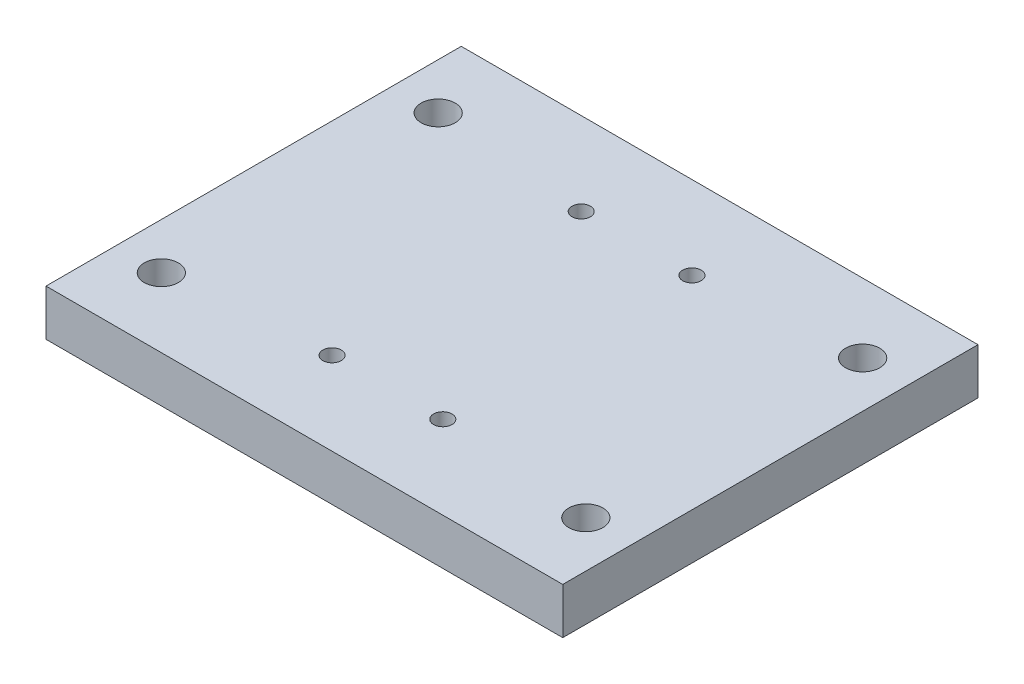
ISO-10303-21;
HEADER;
FILE_DESCRIPTION(('STEP AP214'),'2;1');
FILE_NAME('part.step','',(''),(''),'','','');
FILE_SCHEMA(('AUTOMOTIVE_DESIGN { 1 0 10303 214 1 1 1 1 }'));
ENDSEC;
DATA;
#1=APPLICATION_CONTEXT('core data for automotive mechanical design processes');
#2=APPLICATION_PROTOCOL_DEFINITION('international standard','automotive_design',2000,#1);
#3=PRODUCT_CONTEXT('',#1,'mechanical');
#4=PRODUCT('Part','Part','',(#3));
#5=PRODUCT_RELATED_PRODUCT_CATEGORY('part','',(#4));
#6=PRODUCT_DEFINITION_FORMATION('','',#4);
#7=PRODUCT_DEFINITION_CONTEXT('part definition',#1,'design');
#8=PRODUCT_DEFINITION('design','',#6,#7);
#9=PRODUCT_DEFINITION_SHAPE('','',#8);
#10=(LENGTH_UNIT() NAMED_UNIT(*) SI_UNIT(.MILLI.,.METRE.));
#11=(NAMED_UNIT(*) PLANE_ANGLE_UNIT() SI_UNIT($,.RADIAN.));
#12=(NAMED_UNIT(*) SI_UNIT($,.STERADIAN.) SOLID_ANGLE_UNIT());
#13=UNCERTAINTY_MEASURE_WITH_UNIT(LENGTH_MEASURE(1.E-05),#10,'distance_accuracy_value','');
#14=(GEOMETRIC_REPRESENTATION_CONTEXT(3) GLOBAL_UNCERTAINTY_ASSIGNED_CONTEXT((#13)) GLOBAL_UNIT_ASSIGNED_CONTEXT((#10,
#11,#12)) REPRESENTATION_CONTEXT('',''));
#15=CARTESIAN_POINT('',(0.,0.,0.));
#16=DIRECTION('',(0.,0.,1.));
#17=DIRECTION('',(1.,0.,0.));
#18=AXIS2_PLACEMENT_3D('',#15,#16,#17);
#19=CARTESIAN_POINT('',(0.,5.,0.));
#20=DIRECTION('',(1.,0.,0.));
#21=DIRECTION('',(0.,0.,-1.));
#22=AXIS2_PLACEMENT_3D('',#19,#20,#21);
#23=PLANE('',#22);
#24=DIRECTION('',(0.,0.,1.));
#25=VECTOR('',#24,1.);
#26=CARTESIAN_POINT('',(0.,0.,0.));
#27=LINE('',#26,#25);
#28=CARTESIAN_POINT('',(0.,0.,-45.));
#29=VERTEX_POINT('',#28);
#30=CARTESIAN_POINT('',(0.,0.,0.));
#31=VERTEX_POINT('',#30);
#32=EDGE_CURVE('E99',#29,#31,#27,.T.);
#33=ORIENTED_EDGE('',*,*,#32,.T.);
#34=DIRECTION('',(0.,-1.,0.));
#35=VECTOR('',#34,1.);
#36=CARTESIAN_POINT('',(0.,5.,0.));
#37=LINE('',#36,#35);
#38=CARTESIAN_POINT('',(0.,5.,0.));
#39=VERTEX_POINT('',#38);
#40=EDGE_CURVE('E11',#39,#31,#37,.T.);
#41=ORIENTED_EDGE('',*,*,#40,.F.);
#42=DIRECTION('',(0.,0.,1.));
#43=VECTOR('',#42,1.);
#44=CARTESIAN_POINT('',(0.,5.,0.));
#45=LINE('',#44,#43);
#46=CARTESIAN_POINT('',(0.,5.,-45.));
#47=VERTEX_POINT('',#46);
#48=EDGE_CURVE('E87',#47,#39,#45,.T.);
#49=ORIENTED_EDGE('',*,*,#48,.F.);
#50=DIRECTION('',(0.,-1.,0.));
#51=VECTOR('',#50,1.);
#52=CARTESIAN_POINT('',(0.,5.,-45.));
#53=LINE('',#52,#51);
#54=EDGE_CURVE('E95',#47,#29,#53,.T.);
#55=ORIENTED_EDGE('',*,*,#54,.T.);
#56=EDGE_LOOP('',(#33,#41,#49,#55));
#57=FACE_BOUND('',#56,.T.);
#58=ADVANCED_FACE('F36',(#57),#23,.F.);
#59=CARTESIAN_POINT('',(0.,5.,0.));
#60=DIRECTION('',(0.,0.,-1.));
#61=DIRECTION('',(-1.,0.,0.));
#62=AXIS2_PLACEMENT_3D('',#59,#60,#61);
#63=PLANE('',#62);
#64=DIRECTION('',(1.,0.,0.));
#65=VECTOR('',#64,1.);
#66=CARTESIAN_POINT('',(0.,0.,0.));
#67=LINE('',#66,#65);
#68=CARTESIAN_POINT('',(56.,0.,0.));
#69=VERTEX_POINT('',#68);
#70=EDGE_CURVE('E91',#31,#69,#67,.T.);
#71=ORIENTED_EDGE('',*,*,#70,.T.);
#72=DIRECTION('',(0.,-1.,0.));
#73=VECTOR('',#72,1.);
#74=CARTESIAN_POINT('',(56.,5.,0.));
#75=LINE('',#74,#73);
#76=CARTESIAN_POINT('',(56.,5.,0.));
#77=VERTEX_POINT('',#76);
#78=EDGE_CURVE('E44',#77,#69,#75,.T.);
#79=ORIENTED_EDGE('',*,*,#78,.F.);
#80=DIRECTION('',(1.,0.,0.));
#81=VECTOR('',#80,1.);
#82=CARTESIAN_POINT('',(0.,5.,0.));
#83=LINE('',#82,#81);
#84=EDGE_CURVE('E82',#39,#77,#83,.T.);
#85=ORIENTED_EDGE('',*,*,#84,.F.);
#86=ORIENTED_EDGE('',*,*,#40,.T.);
#87=EDGE_LOOP('',(#71,#79,#85,#86));
#88=FACE_BOUND('',#87,.T.);
#89=ADVANCED_FACE('F90',(#88),#63,.F.);
#90=CARTESIAN_POINT('',(56.,5.,0.));
#91=DIRECTION('',(-1.,0.,0.));
#92=DIRECTION('',(0.,0.,1.));
#93=AXIS2_PLACEMENT_3D('',#90,#91,#92);
#94=PLANE('',#93);
#95=DIRECTION('',(0.,0.,-1.));
#96=VECTOR('',#95,1.);
#97=CARTESIAN_POINT('',(56.,0.,0.));
#98=LINE('',#97,#96);
#99=CARTESIAN_POINT('',(56.,0.,-45.));
#100=VERTEX_POINT('',#99);
#101=EDGE_CURVE('E69',#69,#100,#98,.T.);
#102=ORIENTED_EDGE('',*,*,#101,.T.);
#103=DIRECTION('',(0.,-1.,0.));
#104=VECTOR('',#103,1.);
#105=CARTESIAN_POINT('',(56.,5.,-45.));
#106=LINE('',#105,#104);
#107=CARTESIAN_POINT('',(56.,5.,-45.));
#108=VERTEX_POINT('',#107);
#109=EDGE_CURVE('E92',#108,#100,#106,.T.);
#110=ORIENTED_EDGE('',*,*,#109,.F.);
#111=DIRECTION('',(0.,0.,-1.));
#112=VECTOR('',#111,1.);
#113=CARTESIAN_POINT('',(56.,5.,0.));
#114=LINE('',#113,#112);
#115=EDGE_CURVE('E85',#77,#108,#114,.T.);
#116=ORIENTED_EDGE('',*,*,#115,.F.);
#117=ORIENTED_EDGE('',*,*,#78,.T.);
#118=EDGE_LOOP('',(#102,#110,#116,#117));
#119=FACE_BOUND('',#118,.T.);
#120=ADVANCED_FACE('F93',(#119),#94,.F.);
#121=CARTESIAN_POINT('',(0.,5.,-45.));
#122=DIRECTION('',(0.,0.,1.));
#123=DIRECTION('',(1.,0.,0.));
#124=AXIS2_PLACEMENT_3D('',#121,#122,#123);
#125=PLANE('',#124);
#126=DIRECTION('',(-1.,0.,0.));
#127=VECTOR('',#126,1.);
#128=CARTESIAN_POINT('',(0.,0.,-45.));
#129=LINE('',#128,#127);
#130=EDGE_CURVE('E75',#100,#29,#129,.T.);
#131=ORIENTED_EDGE('',*,*,#130,.T.);
#132=ORIENTED_EDGE('',*,*,#54,.F.);
#133=DIRECTION('',(-1.,0.,0.));
#134=VECTOR('',#133,1.);
#135=CARTESIAN_POINT('',(0.,5.,-45.));
#136=LINE('',#135,#134);
#137=EDGE_CURVE('E52',#108,#47,#136,.T.);
#138=ORIENTED_EDGE('',*,*,#137,.F.);
#139=ORIENTED_EDGE('',*,*,#109,.T.);
#140=EDGE_LOOP('',(#131,#132,#138,#139));
#141=FACE_BOUND('',#140,.T.);
#142=ADVANCED_FACE('F107',(#141),#125,.F.);
#143=CARTESIAN_POINT('',(0.,5.,0.));
#144=DIRECTION('',(0.,-1.,0.));
#145=DIRECTION('',(0.,0.,-1.));
#146=AXIS2_PLACEMENT_3D('',#143,#144,#145);
#147=PLANE('',#146);
#148=CARTESIAN_POINT('',(34.,5.,-36.));
#149=DIRECTION('',(0.,1.,0.));
#150=DIRECTION('',(0.,0.,1.));
#151=AXIS2_PLACEMENT_3D('',#148,#149,#150);
#152=CIRCLE('',#151,0.999999999999998);
#153=CARTESIAN_POINT('',(34.,5.,-35.));
#154=VERTEX_POINT('',#153);
#155=EDGE_CURVE('E146',#154,#154,#152,.T.);
#156=ORIENTED_EDGE('',*,*,#155,.F.);
#157=EDGE_LOOP('',(#156));
#158=FACE_BOUND('',#157,.T.);
#159=CARTESIAN_POINT('',(34.,5.,-9.));
#160=DIRECTION('',(0.,1.,0.));
#161=DIRECTION('',(0.,0.,1.));
#162=AXIS2_PLACEMENT_3D('',#159,#160,#161);
#163=CIRCLE('',#162,0.999999999999998);
#164=CARTESIAN_POINT('',(34.,5.,-8.));
#165=VERTEX_POINT('',#164);
#166=EDGE_CURVE('E152',#165,#165,#163,.T.);
#167=ORIENTED_EDGE('',*,*,#166,.F.);
#168=EDGE_LOOP('',(#167));
#169=FACE_BOUND('',#168,.T.);
#170=CARTESIAN_POINT('',(22.,5.,-9.));
#171=DIRECTION('',(0.,1.,0.));
#172=DIRECTION('',(0.,0.,1.));
#173=AXIS2_PLACEMENT_3D('',#170,#171,#172);
#174=CIRCLE('',#173,1.);
#175=CARTESIAN_POINT('',(22.,5.,-8.));
#176=VERTEX_POINT('',#175);
#177=EDGE_CURVE('E140',#176,#176,#174,.T.);
#178=ORIENTED_EDGE('',*,*,#177,.F.);
#179=EDGE_LOOP('',(#178));
#180=FACE_BOUND('',#179,.T.);
#181=CARTESIAN_POINT('',(22.,5.,-36.));
#182=DIRECTION('',(0.,1.,0.));
#183=DIRECTION('',(0.,0.,1.));
#184=AXIS2_PLACEMENT_3D('',#181,#182,#183);
#185=CIRCLE('',#184,1.);
#186=CARTESIAN_POINT('',(22.,5.,-35.));
#187=VERTEX_POINT('',#186);
#188=EDGE_CURVE('E137',#187,#187,#185,.T.);
#189=ORIENTED_EDGE('',*,*,#188,.F.);
#190=EDGE_LOOP('',(#189));
#191=FACE_BOUND('',#190,.T.);
#192=CARTESIAN_POINT('',(5.,5.,-7.5));
#193=DIRECTION('',(0.,1.,0.));
#194=DIRECTION('',(0.,0.,1.));
#195=AXIS2_PLACEMENT_3D('',#192,#193,#194);
#196=CIRCLE('',#195,1.85);
#197=CARTESIAN_POINT('',(5.,5.,-5.65));
#198=VERTEX_POINT('',#197);
#199=EDGE_CURVE('E119',#198,#198,#196,.T.);
#200=ORIENTED_EDGE('',*,*,#199,.F.);
#201=EDGE_LOOP('',(#200));
#202=FACE_BOUND('',#201,.T.);
#203=CARTESIAN_POINT('',(51.,5.,-7.5));
#204=DIRECTION('',(0.,1.,0.));
#205=DIRECTION('',(0.,0.,1.));
#206=AXIS2_PLACEMENT_3D('',#203,#204,#205);
#207=CIRCLE('',#206,1.85);
#208=CARTESIAN_POINT('',(51.,5.,-5.65));
#209=VERTEX_POINT('',#208);
#210=EDGE_CURVE('E126',#209,#209,#207,.T.);
#211=ORIENTED_EDGE('',*,*,#210,.F.);
#212=EDGE_LOOP('',(#211));
#213=FACE_BOUND('',#212,.T.);
#214=CARTESIAN_POINT('',(51.,5.,-37.5));
#215=DIRECTION('',(0.,1.,0.));
#216=DIRECTION('',(0.,0.,1.));
#217=AXIS2_PLACEMENT_3D('',#214,#215,#216);
#218=CIRCLE('',#217,1.85);
#219=CARTESIAN_POINT('',(51.,5.,-35.65));
#220=VERTEX_POINT('',#219);
#221=EDGE_CURVE('E132',#220,#220,#218,.T.);
#222=ORIENTED_EDGE('',*,*,#221,.F.);
#223=EDGE_LOOP('',(#222));
#224=FACE_BOUND('',#223,.T.);
#225=CARTESIAN_POINT('',(5.,5.,-37.5));
#226=DIRECTION('',(0.,1.,0.));
#227=DIRECTION('',(0.,0.,1.));
#228=AXIS2_PLACEMENT_3D('',#225,#226,#227);
#229=CIRCLE('',#228,1.85);
#230=CARTESIAN_POINT('',(5.,5.,-35.65));
#231=VERTEX_POINT('',#230);
#232=EDGE_CURVE('E113',#231,#231,#229,.T.);
#233=ORIENTED_EDGE('',*,*,#232,.F.);
#234=EDGE_LOOP('',(#233));
#235=FACE_BOUND('',#234,.T.);
#236=ORIENTED_EDGE('',*,*,#48,.T.);
#237=ORIENTED_EDGE('',*,*,#84,.T.);
#238=ORIENTED_EDGE('',*,*,#115,.T.);
#239=ORIENTED_EDGE('',*,*,#137,.T.);
#240=EDGE_LOOP('',(#236,#237,#238,#239));
#241=FACE_BOUND('',#240,.T.);
#242=ADVANCED_FACE('F83',(#158,#169,#180,#191,#202,#213,#224,#235,#241),#147,.F.);
#243=CARTESIAN_POINT('',(0.,0.,0.));
#244=DIRECTION('',(0.,-1.,0.));
#245=DIRECTION('',(0.,0.,-1.));
#246=AXIS2_PLACEMENT_3D('',#243,#244,#245);
#247=PLANE('',#246);
#248=CARTESIAN_POINT('',(34.,0.,-36.));
#249=DIRECTION('',(0.,1.,0.));
#250=DIRECTION('',(0.,0.,1.));
#251=AXIS2_PLACEMENT_3D('',#248,#249,#250);
#252=CIRCLE('',#251,0.999999999999998);
#253=CARTESIAN_POINT('',(34.,0.,-35.));
#254=VERTEX_POINT('',#253);
#255=EDGE_CURVE('E143',#254,#254,#252,.T.);
#256=ORIENTED_EDGE('',*,*,#255,.T.);
#257=EDGE_LOOP('',(#256));
#258=FACE_BOUND('',#257,.T.);
#259=CARTESIAN_POINT('',(34.,0.,-9.));
#260=DIRECTION('',(0.,1.,0.));
#261=DIRECTION('',(0.,0.,1.));
#262=AXIS2_PLACEMENT_3D('',#259,#260,#261);
#263=CIRCLE('',#262,0.999999999999998);
#264=CARTESIAN_POINT('',(34.,0.,-8.));
#265=VERTEX_POINT('',#264);
#266=EDGE_CURVE('E149',#265,#265,#263,.T.);
#267=ORIENTED_EDGE('',*,*,#266,.T.);
#268=EDGE_LOOP('',(#267));
#269=FACE_BOUND('',#268,.T.);
#270=CARTESIAN_POINT('',(22.,0.,-9.));
#271=DIRECTION('',(0.,1.,0.));
#272=DIRECTION('',(0.,0.,1.));
#273=AXIS2_PLACEMENT_3D('',#270,#271,#272);
#274=CIRCLE('',#273,1.);
#275=CARTESIAN_POINT('',(22.,0.,-8.));
#276=VERTEX_POINT('',#275);
#277=EDGE_CURVE('E155',#276,#276,#274,.T.);
#278=ORIENTED_EDGE('',*,*,#277,.T.);
#279=EDGE_LOOP('',(#278));
#280=FACE_BOUND('',#279,.T.);
#281=CARTESIAN_POINT('',(22.,0.,-36.));
#282=DIRECTION('',(0.,1.,0.));
#283=DIRECTION('',(0.,0.,1.));
#284=AXIS2_PLACEMENT_3D('',#281,#282,#283);
#285=CIRCLE('',#284,1.);
#286=CARTESIAN_POINT('',(22.,0.,-35.));
#287=VERTEX_POINT('',#286);
#288=EDGE_CURVE('E123',#287,#287,#285,.T.);
#289=ORIENTED_EDGE('',*,*,#288,.T.);
#290=EDGE_LOOP('',(#289));
#291=FACE_BOUND('',#290,.T.);
#292=ORIENTED_EDGE('',*,*,#32,.F.);
#293=ORIENTED_EDGE('',*,*,#130,.F.);
#294=ORIENTED_EDGE('',*,*,#101,.F.);
#295=ORIENTED_EDGE('',*,*,#70,.F.);
#296=EDGE_LOOP('',(#292,#293,#294,#295));
#297=FACE_BOUND('',#296,.T.);
#298=ADVANCED_FACE('F110',(#258,#269,#280,#291,#297),#247,.T.);
#299=CARTESIAN_POINT('',(5.,2.,-37.5));
#300=DIRECTION('',(0.,1.,0.));
#301=DIRECTION('',(0.,0.,1.));
#302=AXIS2_PLACEMENT_3D('',#299,#300,#301);
#303=CYLINDRICAL_SURFACE('',#302,1.85);
#304=CARTESIAN_POINT('',(5.,2.,-37.5));
#305=DIRECTION('',(0.,1.,0.));
#306=DIRECTION('',(0.,0.,1.));
#307=AXIS2_PLACEMENT_3D('',#304,#305,#306);
#308=CIRCLE('',#307,1.85);
#309=CARTESIAN_POINT('',(5.,2.,-35.65));
#310=VERTEX_POINT('',#309);
#311=EDGE_CURVE('E102',#310,#310,#308,.T.);
#312=ORIENTED_EDGE('',*,*,#311,.F.);
#313=EDGE_LOOP('',(#312));
#314=FACE_BOUND('',#313,.T.);
#315=ORIENTED_EDGE('',*,*,#232,.T.);
#316=EDGE_LOOP('',(#315));
#317=FACE_BOUND('',#316,.T.);
#318=ADVANCED_FACE('F177',(#314,#317),#303,.F.);
#319=CARTESIAN_POINT('',(0.,2.,0.));
#320=DIRECTION('',(0.,1.,0.));
#321=DIRECTION('',(0.,0.,1.));
#322=AXIS2_PLACEMENT_3D('',#319,#320,#321);
#323=PLANE('',#322);
#324=ORIENTED_EDGE('',*,*,#311,.T.);
#325=EDGE_LOOP('',(#324));
#326=FACE_BOUND('',#325,.T.);
#327=ADVANCED_FACE('F179',(#326),#323,.T.);
#328=CARTESIAN_POINT('',(51.,2.,-37.5));
#329=DIRECTION('',(0.,1.,0.));
#330=DIRECTION('',(0.,0.,1.));
#331=AXIS2_PLACEMENT_3D('',#328,#329,#330);
#332=CYLINDRICAL_SURFACE('',#331,1.85);
#333=CARTESIAN_POINT('',(51.,2.,-37.5));
#334=DIRECTION('',(0.,1.,0.));
#335=DIRECTION('',(0.,0.,1.));
#336=AXIS2_PLACEMENT_3D('',#333,#334,#335);
#337=CIRCLE('',#336,1.85);
#338=CARTESIAN_POINT('',(51.,2.,-35.65));
#339=VERTEX_POINT('',#338);
#340=EDGE_CURVE('E116',#339,#339,#337,.T.);
#341=ORIENTED_EDGE('',*,*,#340,.F.);
#342=EDGE_LOOP('',(#341));
#343=FACE_BOUND('',#342,.T.);
#344=ORIENTED_EDGE('',*,*,#221,.T.);
#345=EDGE_LOOP('',(#344));
#346=FACE_BOUND('',#345,.T.);
#347=ADVANCED_FACE('F186',(#343,#346),#332,.F.);
#348=CARTESIAN_POINT('',(0.,2.,0.));
#349=DIRECTION('',(0.,1.,0.));
#350=DIRECTION('',(0.,0.,1.));
#351=AXIS2_PLACEMENT_3D('',#348,#349,#350);
#352=PLANE('',#351);
#353=ORIENTED_EDGE('',*,*,#340,.T.);
#354=EDGE_LOOP('',(#353));
#355=FACE_BOUND('',#354,.T.);
#356=ADVANCED_FACE('F267',(#355),#352,.T.);
#357=CARTESIAN_POINT('',(51.,2.,-7.5));
#358=DIRECTION('',(0.,1.,0.));
#359=DIRECTION('',(0.,0.,1.));
#360=AXIS2_PLACEMENT_3D('',#357,#358,#359);
#361=CYLINDRICAL_SURFACE('',#360,1.85);
#362=CARTESIAN_POINT('',(51.,2.,-7.5));
#363=DIRECTION('',(0.,1.,0.));
#364=DIRECTION('',(0.,0.,1.));
#365=AXIS2_PLACEMENT_3D('',#362,#363,#364);
#366=CIRCLE('',#365,1.85);
#367=CARTESIAN_POINT('',(51.,2.,-5.65));
#368=VERTEX_POINT('',#367);
#369=EDGE_CURVE('E129',#368,#368,#366,.T.);
#370=ORIENTED_EDGE('',*,*,#369,.F.);
#371=EDGE_LOOP('',(#370));
#372=FACE_BOUND('',#371,.T.);
#373=ORIENTED_EDGE('',*,*,#210,.T.);
#374=EDGE_LOOP('',(#373));
#375=FACE_BOUND('',#374,.T.);
#376=ADVANCED_FACE('F270',(#372,#375),#361,.F.);
#377=CARTESIAN_POINT('',(0.,2.,0.));
#378=DIRECTION('',(0.,1.,0.));
#379=DIRECTION('',(0.,0.,1.));
#380=AXIS2_PLACEMENT_3D('',#377,#378,#379);
#381=PLANE('',#380);
#382=ORIENTED_EDGE('',*,*,#369,.T.);
#383=EDGE_LOOP('',(#382));
#384=FACE_BOUND('',#383,.T.);
#385=ADVANCED_FACE('F275',(#384),#381,.T.);
#386=CARTESIAN_POINT('',(5.,2.,-7.5));
#387=DIRECTION('',(0.,1.,0.));
#388=DIRECTION('',(0.,0.,1.));
#389=AXIS2_PLACEMENT_3D('',#386,#387,#388);
#390=CYLINDRICAL_SURFACE('',#389,1.85);
#391=CARTESIAN_POINT('',(5.,2.,-7.5));
#392=DIRECTION('',(0.,1.,0.));
#393=DIRECTION('',(0.,0.,1.));
#394=AXIS2_PLACEMENT_3D('',#391,#392,#393);
#395=CIRCLE('',#394,1.85);
#396=CARTESIAN_POINT('',(5.,2.,-5.65));
#397=VERTEX_POINT('',#396);
#398=EDGE_CURVE('E122',#397,#397,#395,.T.);
#399=ORIENTED_EDGE('',*,*,#398,.F.);
#400=EDGE_LOOP('',(#399));
#401=FACE_BOUND('',#400,.T.);
#402=ORIENTED_EDGE('',*,*,#199,.T.);
#403=EDGE_LOOP('',(#402));
#404=FACE_BOUND('',#403,.T.);
#405=ADVANCED_FACE('F278',(#401,#404),#390,.F.);
#406=CARTESIAN_POINT('',(0.,2.,0.));
#407=DIRECTION('',(0.,1.,0.));
#408=DIRECTION('',(0.,0.,1.));
#409=AXIS2_PLACEMENT_3D('',#406,#407,#408);
#410=PLANE('',#409);
#411=ORIENTED_EDGE('',*,*,#398,.T.);
#412=EDGE_LOOP('',(#411));
#413=FACE_BOUND('',#412,.T.);
#414=ADVANCED_FACE('F228',(#413),#410,.T.);
#415=CARTESIAN_POINT('',(22.,0.,-36.));
#416=DIRECTION('',(0.,1.,0.));
#417=DIRECTION('',(0.,0.,1.));
#418=AXIS2_PLACEMENT_3D('',#415,#416,#417);
#419=CYLINDRICAL_SURFACE('',#418,1.);
#420=ORIENTED_EDGE('',*,*,#288,.F.);
#421=EDGE_LOOP('',(#420));
#422=FACE_BOUND('',#421,.T.);
#423=ORIENTED_EDGE('',*,*,#188,.T.);
#424=EDGE_LOOP('',(#423));
#425=FACE_BOUND('',#424,.T.);
#426=ADVANCED_FACE('F223',(#422,#425),#419,.F.);
#427=CARTESIAN_POINT('',(22.,0.,-9.));
#428=DIRECTION('',(0.,1.,0.));
#429=DIRECTION('',(0.,0.,1.));
#430=AXIS2_PLACEMENT_3D('',#427,#428,#429);
#431=CYLINDRICAL_SURFACE('',#430,1.);
#432=ORIENTED_EDGE('',*,*,#277,.F.);
#433=EDGE_LOOP('',(#432));
#434=FACE_BOUND('',#433,.T.);
#435=ORIENTED_EDGE('',*,*,#177,.T.);
#436=EDGE_LOOP('',(#435));
#437=FACE_BOUND('',#436,.T.);
#438=ADVANCED_FACE('F161',(#434,#437),#431,.F.);
#439=CARTESIAN_POINT('',(34.,0.,-9.));
#440=DIRECTION('',(0.,1.,0.));
#441=DIRECTION('',(0.,0.,1.));
#442=AXIS2_PLACEMENT_3D('',#439,#440,#441);
#443=CYLINDRICAL_SURFACE('',#442,0.999999999999998);
#444=ORIENTED_EDGE('',*,*,#266,.F.);
#445=EDGE_LOOP('',(#444));
#446=FACE_BOUND('',#445,.T.);
#447=ORIENTED_EDGE('',*,*,#166,.T.);
#448=EDGE_LOOP('',(#447));
#449=FACE_BOUND('',#448,.T.);
#450=ADVANCED_FACE('F240',(#446,#449),#443,.F.);
#451=CARTESIAN_POINT('',(34.,0.,-36.));
#452=DIRECTION('',(0.,1.,0.));
#453=DIRECTION('',(0.,0.,1.));
#454=AXIS2_PLACEMENT_3D('',#451,#452,#453);
#455=CYLINDRICAL_SURFACE('',#454,0.999999999999998);
#456=ORIENTED_EDGE('',*,*,#255,.F.);
#457=EDGE_LOOP('',(#456));
#458=FACE_BOUND('',#457,.T.);
#459=ORIENTED_EDGE('',*,*,#155,.T.);
#460=EDGE_LOOP('',(#459));
#461=FACE_BOUND('',#460,.T.);
#462=ADVANCED_FACE('F250',(#458,#461),#455,.F.);
#463=CLOSED_SHELL('',(#58,#89,#120,#142,#242,#298,#318,#327,#347,#356,#376,#385,#405,#414,#426,
#438,#450,#462));
#464=MANIFOLD_SOLID_BREP('B2',#463);
#465=ADVANCED_BREP_SHAPE_REPRESENTATION('',(#18,#464),#14);
#466=SHAPE_DEFINITION_REPRESENTATION(#9,#465);
ENDSEC;
END-ISO-10303-21;
